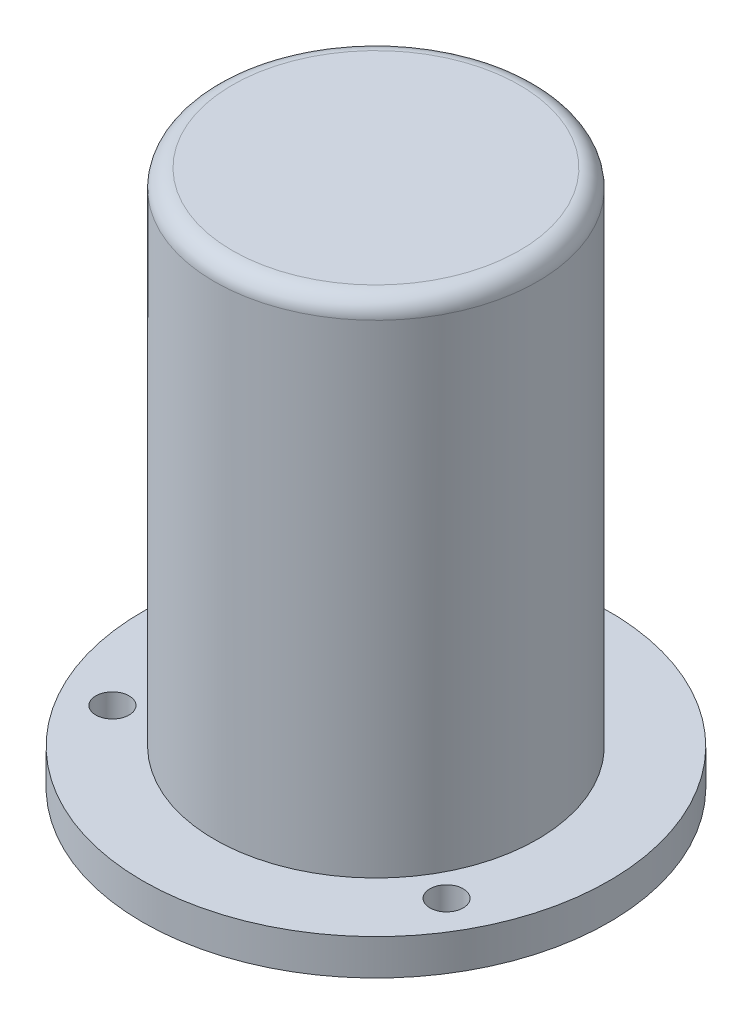
ISO-10303-21;
HEADER;
FILE_DESCRIPTION(('STEP AP214'),'2;1');
FILE_NAME('part.step','',(''),(''),'','','');
FILE_SCHEMA(('AUTOMOTIVE_DESIGN { 1 0 10303 214 1 1 1 1 }'));
ENDSEC;
DATA;
#1=APPLICATION_CONTEXT('core data for automotive mechanical design processes');
#2=APPLICATION_PROTOCOL_DEFINITION('international standard','automotive_design',2000,#1);
#3=PRODUCT_CONTEXT('',#1,'mechanical');
#4=PRODUCT('Part','Part','',(#3));
#5=PRODUCT_RELATED_PRODUCT_CATEGORY('part','',(#4));
#6=PRODUCT_DEFINITION_FORMATION('','',#4);
#7=PRODUCT_DEFINITION_CONTEXT('part definition',#1,'design');
#8=PRODUCT_DEFINITION('design','',#6,#7);
#9=PRODUCT_DEFINITION_SHAPE('','',#8);
#10=(LENGTH_UNIT() NAMED_UNIT(*) SI_UNIT(.MILLI.,.METRE.));
#11=(NAMED_UNIT(*) PLANE_ANGLE_UNIT() SI_UNIT($,.RADIAN.));
#12=(NAMED_UNIT(*) SI_UNIT($,.STERADIAN.) SOLID_ANGLE_UNIT());
#13=UNCERTAINTY_MEASURE_WITH_UNIT(LENGTH_MEASURE(1.E-05),#10,'distance_accuracy_value','');
#14=(GEOMETRIC_REPRESENTATION_CONTEXT(3) GLOBAL_UNCERTAINTY_ASSIGNED_CONTEXT((#13)) GLOBAL_UNIT_ASSIGNED_CONTEXT((#10,
#11,#12)) REPRESENTATION_CONTEXT('',''));
#15=CARTESIAN_POINT('',(0.,0.,0.));
#16=DIRECTION('',(0.,0.,1.));
#17=DIRECTION('',(1.,0.,0.));
#18=AXIS2_PLACEMENT_3D('',#15,#16,#17);
#19=CARTESIAN_POINT('',(0.,3.175,0.));
#20=DIRECTION('',(0.,1.,0.));
#21=DIRECTION('',(0.,0.,1.));
#22=AXIS2_PLACEMENT_3D('',#19,#20,#21);
#23=PLANE('',#22);
#24=CARTESIAN_POINT('',(-14.7820144121159,3.175,8.53439999999986));
#25=DIRECTION('',(0.,1.,0.));
#26=DIRECTION('',(0.,0.,1.));
#27=AXIS2_PLACEMENT_3D('',#24,#25,#26);
#28=CIRCLE('',#27,1.4732);
#29=CARTESIAN_POINT('',(-14.7820144121159,3.175,10.0075999999999));
#30=VERTEX_POINT('',#29);
#31=EDGE_CURVE('E73',#30,#30,#28,.T.);
#32=ORIENTED_EDGE('',*,*,#31,.F.);
#33=EDGE_LOOP('',(#32));
#34=FACE_BOUND('',#33,.T.);
#35=CARTESIAN_POINT('',(14.7820144121158,3.175,8.53440000000007));
#36=DIRECTION('',(0.,1.,0.));
#37=DIRECTION('',(0.,0.,1.));
#38=AXIS2_PLACEMENT_3D('',#35,#36,#37);
#39=CIRCLE('',#38,1.4732);
#40=CARTESIAN_POINT('',(14.7820144121158,3.175,10.0076000000001));
#41=VERTEX_POINT('',#40);
#42=EDGE_CURVE('E67',#41,#41,#39,.T.);
#43=ORIENTED_EDGE('',*,*,#42,.F.);
#44=EDGE_LOOP('',(#43));
#45=FACE_BOUND('',#44,.T.);
#46=CARTESIAN_POINT('',(0.,3.175,-17.0688));
#47=DIRECTION('',(0.,1.,0.));
#48=DIRECTION('',(0.,0.,1.));
#49=AXIS2_PLACEMENT_3D('',#46,#47,#48);
#50=CIRCLE('',#49,1.4732);
#51=CARTESIAN_POINT('',(0.,3.175,-15.5956));
#52=VERTEX_POINT('',#51);
#53=EDGE_CURVE('E61',#52,#52,#50,.T.);
#54=ORIENTED_EDGE('',*,*,#53,.F.);
#55=EDGE_LOOP('',(#54));
#56=FACE_BOUND('',#55,.T.);
#57=CARTESIAN_POINT('',(0.,3.175,0.));
#58=DIRECTION('',(0.,1.,0.));
#59=DIRECTION('',(0.,0.,1.));
#60=AXIS2_PLACEMENT_3D('',#57,#58,#59);
#61=CIRCLE('',#60,20.6375);
#62=CARTESIAN_POINT('',(0.,3.175,20.6375));
#63=VERTEX_POINT('',#62);
#64=EDGE_CURVE('E48',#63,#63,#61,.T.);
#65=ORIENTED_EDGE('',*,*,#64,.T.);
#66=EDGE_LOOP('',(#65));
#67=FACE_BOUND('',#66,.T.);
#68=CARTESIAN_POINT('',(0.,3.175,0.));
#69=DIRECTION('',(0.,1.,0.));
#70=DIRECTION('',(0.,0.,1.));
#71=AXIS2_PLACEMENT_3D('',#68,#69,#70);
#72=CIRCLE('',#71,14.2875);
#73=CARTESIAN_POINT('',(0.,3.17499999999999,-14.2875));
#74=VERTEX_POINT('',#73);
#75=EDGE_CURVE('E56',#74,#74,#72,.F.);
#76=ORIENTED_EDGE('',*,*,#75,.T.);
#77=EDGE_LOOP('',(#76));
#78=FACE_BOUND('',#77,.T.);
#79=ADVANCED_FACE('F37',(#34,#45,#56,#67,#78),#23,.T.);
#80=CARTESIAN_POINT('',(0.,3.175,0.));
#81=DIRECTION('',(0.,-1.,0.));
#82=DIRECTION('',(0.,0.,-1.));
#83=AXIS2_PLACEMENT_3D('',#80,#81,#82);
#84=CYLINDRICAL_SURFACE('',#83,20.6375);
#85=ORIENTED_EDGE('',*,*,#64,.F.);
#86=EDGE_LOOP('',(#85));
#87=FACE_BOUND('',#86,.T.);
#88=CARTESIAN_POINT('',(0.,0.,0.));
#89=DIRECTION('',(0.,1.,0.));
#90=DIRECTION('',(0.,0.,1.));
#91=AXIS2_PLACEMENT_3D('',#88,#89,#90);
#92=CIRCLE('',#91,20.6375);
#93=CARTESIAN_POINT('',(0.,0.,20.6375));
#94=VERTEX_POINT('',#93);
#95=EDGE_CURVE('E52',#94,#94,#92,.T.);
#96=ORIENTED_EDGE('',*,*,#95,.T.);
#97=EDGE_LOOP('',(#96));
#98=FACE_BOUND('',#97,.T.);
#99=ADVANCED_FACE('F92',(#87,#98),#84,.T.);
#100=CARTESIAN_POINT('',(0.,0.,0.));
#101=DIRECTION('',(0.,1.,0.));
#102=DIRECTION('',(0.,0.,1.));
#103=AXIS2_PLACEMENT_3D('',#100,#101,#102);
#104=PLANE('',#103);
#105=CARTESIAN_POINT('',(0.,0.,0.));
#106=DIRECTION('',(0.,-1.,0.));
#107=DIRECTION('',(0.,0.,-1.));
#108=AXIS2_PLACEMENT_3D('',#105,#106,#107);
#109=CIRCLE('',#108,13.6144);
#110=CARTESIAN_POINT('',(0.,0.,-13.6144));
#111=VERTEX_POINT('',#110);
#112=EDGE_CURVE('E81',#111,#111,#109,.T.);
#113=ORIENTED_EDGE('',*,*,#112,.F.);
#114=EDGE_LOOP('',(#113));
#115=FACE_BOUND('',#114,.T.);
#116=CARTESIAN_POINT('',(-14.7820144121159,0.,8.53439999999986));
#117=DIRECTION('',(0.,1.,0.));
#118=DIRECTION('',(0.,0.,1.));
#119=AXIS2_PLACEMENT_3D('',#116,#117,#118);
#120=CIRCLE('',#119,1.4732);
#121=CARTESIAN_POINT('',(-14.7820144121159,0.,10.0075999999999));
#122=VERTEX_POINT('',#121);
#123=EDGE_CURVE('E70',#122,#122,#120,.T.);
#124=ORIENTED_EDGE('',*,*,#123,.T.);
#125=EDGE_LOOP('',(#124));
#126=FACE_BOUND('',#125,.T.);
#127=CARTESIAN_POINT('',(14.7820144121158,0.,8.53440000000007));
#128=DIRECTION('',(0.,1.,0.));
#129=DIRECTION('',(0.,0.,1.));
#130=AXIS2_PLACEMENT_3D('',#127,#128,#129);
#131=CIRCLE('',#130,1.4732);
#132=CARTESIAN_POINT('',(14.7820144121158,0.,10.0076000000001));
#133=VERTEX_POINT('',#132);
#134=EDGE_CURVE('E64',#133,#133,#131,.T.);
#135=ORIENTED_EDGE('',*,*,#134,.T.);
#136=EDGE_LOOP('',(#135));
#137=FACE_BOUND('',#136,.T.);
#138=CARTESIAN_POINT('',(0.,0.,-17.0688));
#139=DIRECTION('',(0.,1.,0.));
#140=DIRECTION('',(0.,0.,1.));
#141=AXIS2_PLACEMENT_3D('',#138,#139,#140);
#142=CIRCLE('',#141,1.4732);
#143=CARTESIAN_POINT('',(0.,0.,-15.5956));
#144=VERTEX_POINT('',#143);
#145=EDGE_CURVE('E60',#144,#144,#142,.T.);
#146=ORIENTED_EDGE('',*,*,#145,.T.);
#147=EDGE_LOOP('',(#146));
#148=FACE_BOUND('',#147,.T.);
#149=ORIENTED_EDGE('',*,*,#95,.F.);
#150=EDGE_LOOP('',(#149));
#151=FACE_BOUND('',#150,.T.);
#152=ADVANCED_FACE('F88',(#115,#126,#137,#148,#151),#104,.F.);
#153=CARTESIAN_POINT('',(0.,47.498,0.));
#154=DIRECTION('',(0.,-1.,0.));
#155=DIRECTION('',(0.,0.,-1.));
#156=AXIS2_PLACEMENT_3D('',#153,#154,#155);
#157=CYLINDRICAL_SURFACE('',#156,14.2875);
#158=CARTESIAN_POINT('',(0.,45.9105,0.));
#159=DIRECTION('',(0.,1.,0.));
#160=DIRECTION('',(0.,0.,1.));
#161=AXIS2_PLACEMENT_3D('',#158,#159,#160);
#162=CIRCLE('',#161,14.2875);
#163=CARTESIAN_POINT('',(0.,45.9105,-14.2875));
#164=VERTEX_POINT('',#163);
#165=EDGE_CURVE('E11',#164,#164,#162,.F.);
#166=CARTESIAN_POINT('',(0.,45.9105,-14.2875));
#167=CARTESIAN_POINT('',(0.,45.4653385416667,-14.2875));
#168=CARTESIAN_POINT('',(0.,45.0201770833333,-14.2875));
#169=CARTESIAN_POINT('',(0.,44.1298541666667,-14.2875));
#170=CARTESIAN_POINT('',(0.,43.6846927083333,-14.2875));
#171=CARTESIAN_POINT('',(0.,42.7943697916667,-14.2875));
#172=CARTESIAN_POINT('',(0.,42.3492083333333,-14.2875));
#173=CARTESIAN_POINT('',(0.,41.4588854166667,-14.2875));
#174=CARTESIAN_POINT('',(0.,41.0137239583333,-14.2875));
#175=CARTESIAN_POINT('',(0.,40.1234010416667,-14.2875));
#176=CARTESIAN_POINT('',(0.,39.6782395833333,-14.2875));
#177=CARTESIAN_POINT('',(0.,38.7879166666667,-14.2875));
#178=CARTESIAN_POINT('',(0.,38.3427552083333,-14.2875));
#179=CARTESIAN_POINT('',(0.,37.4524322916667,-14.2875));
#180=CARTESIAN_POINT('',(0.,37.0072708333333,-14.2875));
#181=CARTESIAN_POINT('',(0.,36.1169479166667,-14.2875));
#182=CARTESIAN_POINT('',(0.,35.6717864583333,-14.2875));
#183=CARTESIAN_POINT('',(0.,34.7814635416667,-14.2875));
#184=CARTESIAN_POINT('',(0.,34.3363020833333,-14.2875));
#185=CARTESIAN_POINT('',(0.,33.4459791666667,-14.2875));
#186=CARTESIAN_POINT('',(0.,33.0008177083333,-14.2875));
#187=CARTESIAN_POINT('',(0.,32.1104947916667,-14.2875));
#188=CARTESIAN_POINT('',(0.,31.6653333333333,-14.2875));
#189=CARTESIAN_POINT('',(0.,30.7750104166667,-14.2875));
#190=CARTESIAN_POINT('',(0.,30.3298489583333,-14.2875));
#191=CARTESIAN_POINT('',(0.,29.4395260416667,-14.2875));
#192=CARTESIAN_POINT('',(0.,28.9943645833333,-14.2875));
#193=CARTESIAN_POINT('',(0.,28.1040416666667,-14.2875));
#194=CARTESIAN_POINT('',(0.,27.6588802083333,-14.2875));
#195=CARTESIAN_POINT('',(0.,26.7685572916667,-14.2875));
#196=CARTESIAN_POINT('',(0.,26.3233958333333,-14.2875));
#197=CARTESIAN_POINT('',(0.,25.4330729166667,-14.2875));
#198=CARTESIAN_POINT('',(0.,24.9879114583333,-14.2875));
#199=CARTESIAN_POINT('',(0.,24.0975885416667,-14.2875));
#200=CARTESIAN_POINT('',(0.,23.6524270833333,-14.2875));
#201=CARTESIAN_POINT('',(0.,22.7621041666667,-14.2875));
#202=CARTESIAN_POINT('',(0.,22.3169427083333,-14.2875));
#203=CARTESIAN_POINT('',(0.,21.4266197916667,-14.2875));
#204=CARTESIAN_POINT('',(0.,20.9814583333333,-14.2875));
#205=CARTESIAN_POINT('',(0.,20.0911354166667,-14.2875));
#206=CARTESIAN_POINT('',(0.,19.6459739583333,-14.2875));
#207=CARTESIAN_POINT('',(0.,18.7556510416667,-14.2875));
#208=CARTESIAN_POINT('',(0.,18.3104895833333,-14.2875));
#209=CARTESIAN_POINT('',(0.,17.4201666666667,-14.2875));
#210=CARTESIAN_POINT('',(0.,16.9750052083333,-14.2875));
#211=CARTESIAN_POINT('',(0.,16.0846822916667,-14.2875));
#212=CARTESIAN_POINT('',(0.,15.6395208333333,-14.2875));
#213=CARTESIAN_POINT('',(0.,14.7491979166667,-14.2875));
#214=CARTESIAN_POINT('',(0.,14.3040364583333,-14.2875));
#215=CARTESIAN_POINT('',(0.,13.4137135416667,-14.2875));
#216=CARTESIAN_POINT('',(0.,12.9685520833333,-14.2875));
#217=CARTESIAN_POINT('',(0.,12.0782291666667,-14.2875));
#218=CARTESIAN_POINT('',(0.,11.6330677083333,-14.2875));
#219=CARTESIAN_POINT('',(0.,10.7427447916667,-14.2875));
#220=CARTESIAN_POINT('',(0.,10.2975833333333,-14.2875));
#221=CARTESIAN_POINT('',(0.,9.40726041666666,-14.2875));
#222=CARTESIAN_POINT('',(0.,8.96209895833333,-14.2875));
#223=CARTESIAN_POINT('',(0.,8.07177604166666,-14.2875));
#224=CARTESIAN_POINT('',(0.,7.62661458333333,-14.2875));
#225=CARTESIAN_POINT('',(0.,6.73629166666666,-14.2875));
#226=CARTESIAN_POINT('',(0.,6.29113020833333,-14.2875));
#227=CARTESIAN_POINT('',(0.,5.40080729166666,-14.2875));
#228=CARTESIAN_POINT('',(0.,4.95564583333333,-14.2875));
#229=CARTESIAN_POINT('',(0.,4.06532291666666,-14.2875));
#230=CARTESIAN_POINT('',(0.,3.62016145833332,-14.2875));
#231=CARTESIAN_POINT('',(0.,3.17499999999999,-14.2875));
#232=B_SPLINE_CURVE_WITH_KNOTS('',3,(#166,#167,#168,#169,#170,#171,#172,#173,#174,#175,#176,
#177,#178,#179,#180,#181,#182,#183,#184,#185,#186,#187,#188,#189,#190,#191,#192,#193,#194,#195,
#196,#197,#198,#199,#200,#201,#202,#203,#204,#205,#206,#207,#208,#209,#210,#211,#212,#213,#214,
#215,#216,#217,#218,#219,#220,#221,#222,#223,#224,#225,#226,#227,#228,#229,#230,#231),
.UNSPECIFIED.,.F.,.F.,(4,2,2,2,2,2,2,2,2,2,2,2,2,2,2,2,2,2,2,2,2,2,2,2,2,2,2,2,2,2,2,2,4),(0.,
1.335484375,2.67096875,4.006453125,5.3419375,6.67742187500001,8.01290625,9.348390625,10.683875,
12.019359375,13.35484375,14.690328125,16.0258125,17.361296875,18.69678125,20.032265625,21.36775,
22.703234375,24.03871875,25.374203125,26.7096875,28.045171875,29.38065625,30.716140625,
32.051625,33.387109375,34.72259375,36.058078125,37.3935625,38.729046875,40.06453125,
41.400015625,42.7355),.UNSPECIFIED.);
#233=EDGE_CURVE('BSEAM91',#164,#74,#232,.T.);
#234=ORIENTED_EDGE('',*,*,#165,.T.);
#235=ORIENTED_EDGE('',*,*,#75,.F.);
#236=ORIENTED_EDGE('',*,*,#233,.T.);
#237=ORIENTED_EDGE('',*,*,#233,.F.);
#238=EDGE_LOOP('',(#234,#236,#235,#237));
#239=FACE_BOUND('',#238,.T.);
#240=ADVANCED_FACE('F91',(#239),#157,.T.);
#241=CARTESIAN_POINT('',(0.,47.498,0.));
#242=DIRECTION('',(0.,1.,0.));
#243=DIRECTION('',(0.,0.,1.));
#244=AXIS2_PLACEMENT_3D('',#241,#242,#243);
#245=PLANE('',#244);
#246=CARTESIAN_POINT('',(0.,47.498,0.));
#247=DIRECTION('',(0.,1.,0.));
#248=DIRECTION('',(0.,0.,1.));
#249=AXIS2_PLACEMENT_3D('',#246,#247,#248);
#250=CIRCLE('',#249,12.7);
#251=CARTESIAN_POINT('',(0.,47.498,12.7));
#252=VERTEX_POINT('',#251);
#253=EDGE_CURVE('E44',#252,#252,#250,.T.);
#254=ORIENTED_EDGE('',*,*,#253,.T.);
#255=EDGE_LOOP('',(#254));
#256=FACE_BOUND('',#255,.T.);
#257=ADVANCED_FACE('F113',(#256),#245,.T.);
#258=CARTESIAN_POINT('',(0.,0.,-17.0688));
#259=DIRECTION('',(0.,1.,0.));
#260=DIRECTION('',(0.,0.,1.));
#261=AXIS2_PLACEMENT_3D('',#258,#259,#260);
#262=CYLINDRICAL_SURFACE('',#261,1.4732);
#263=ORIENTED_EDGE('',*,*,#145,.F.);
#264=EDGE_LOOP('',(#263));
#265=FACE_BOUND('',#264,.T.);
#266=ORIENTED_EDGE('',*,*,#53,.T.);
#267=EDGE_LOOP('',(#266));
#268=FACE_BOUND('',#267,.T.);
#269=ADVANCED_FACE('F116',(#265,#268),#262,.F.);
#270=CARTESIAN_POINT('',(14.7820144121158,0.,8.53440000000007));
#271=DIRECTION('',(0.,1.,0.));
#272=DIRECTION('',(0.,0.,1.));
#273=AXIS2_PLACEMENT_3D('',#270,#271,#272);
#274=CYLINDRICAL_SURFACE('',#273,1.4732);
#275=ORIENTED_EDGE('',*,*,#134,.F.);
#276=EDGE_LOOP('',(#275));
#277=FACE_BOUND('',#276,.T.);
#278=ORIENTED_EDGE('',*,*,#42,.T.);
#279=EDGE_LOOP('',(#278));
#280=FACE_BOUND('',#279,.T.);
#281=ADVANCED_FACE('F119',(#277,#280),#274,.F.);
#282=CARTESIAN_POINT('',(-14.7820144121159,0.,8.53439999999986));
#283=DIRECTION('',(0.,1.,0.));
#284=DIRECTION('',(0.,0.,1.));
#285=AXIS2_PLACEMENT_3D('',#282,#283,#284);
#286=CYLINDRICAL_SURFACE('',#285,1.4732);
#287=ORIENTED_EDGE('',*,*,#123,.F.);
#288=EDGE_LOOP('',(#287));
#289=FACE_BOUND('',#288,.T.);
#290=ORIENTED_EDGE('',*,*,#31,.T.);
#291=EDGE_LOOP('',(#290));
#292=FACE_BOUND('',#291,.T.);
#293=ADVANCED_FACE('F123',(#289,#292),#286,.F.);
#294=CARTESIAN_POINT('',(0.,46.8122,0.));
#295=DIRECTION('',(0.,1.,0.));
#296=DIRECTION('',(0.,0.,1.));
#297=AXIS2_PLACEMENT_3D('',#294,#295,#296);
#298=PLANE('',#297);
#299=CARTESIAN_POINT('',(0.,46.8122,0.));
#300=DIRECTION('',(0.,1.,0.));
#301=DIRECTION('',(0.,0.,1.));
#302=AXIS2_PLACEMENT_3D('',#299,#300,#301);
#303=CIRCLE('',#302,13.6144);
#304=CARTESIAN_POINT('',(0.,46.8122,13.6144));
#305=VERTEX_POINT('',#304);
#306=EDGE_CURVE('E76',#305,#305,#303,.F.);
#307=ORIENTED_EDGE('',*,*,#306,.T.);
#308=EDGE_LOOP('',(#307));
#309=FACE_BOUND('',#308,.T.);
#310=ADVANCED_FACE('F127',(#309),#298,.F.);
#311=CARTESIAN_POINT('',(0.,86.0053382471445,0.));
#312=DIRECTION('',(0.,-1.,0.));
#313=DIRECTION('',(0.,0.,-1.));
#314=AXIS2_PLACEMENT_3D('',#311,#312,#313);
#315=CYLINDRICAL_SURFACE('',#314,13.6144);
#316=ORIENTED_EDGE('',*,*,#112,.T.);
#317=EDGE_LOOP('',(#316));
#318=FACE_BOUND('',#317,.T.);
#319=ORIENTED_EDGE('',*,*,#306,.F.);
#320=EDGE_LOOP('',(#319));
#321=FACE_BOUND('',#320,.T.);
#322=ADVANCED_FACE('F85',(#318,#321),#315,.F.);
#323=CARTESIAN_POINT('',(0.,45.9105,0.));
#324=DIRECTION('',(0.,1.,0.));
#325=DIRECTION('',(0.,0.,1.));
#326=AXIS2_PLACEMENT_3D('',#323,#324,#325);
#327=TOROIDAL_SURFACE('',#326,12.7,1.5875);
#328=ORIENTED_EDGE('',*,*,#165,.F.);
#329=EDGE_LOOP('',(#328));
#330=FACE_BOUND('',#329,.T.);
#331=ORIENTED_EDGE('',*,*,#253,.F.);
#332=EDGE_LOOP('',(#331));
#333=FACE_BOUND('',#332,.T.);
#334=ADVANCED_FACE('F39',(#330,#333),#327,.T.);
#335=CLOSED_SHELL('',(#79,#99,#152,#240,#257,#269,#281,#293,#310,#322,#334));
#336=MANIFOLD_SOLID_BREP('B2',#335);
#337=ADVANCED_BREP_SHAPE_REPRESENTATION('',(#18,#336),#14);
#338=SHAPE_DEFINITION_REPRESENTATION(#9,#337);
ENDSEC;
END-ISO-10303-21;
